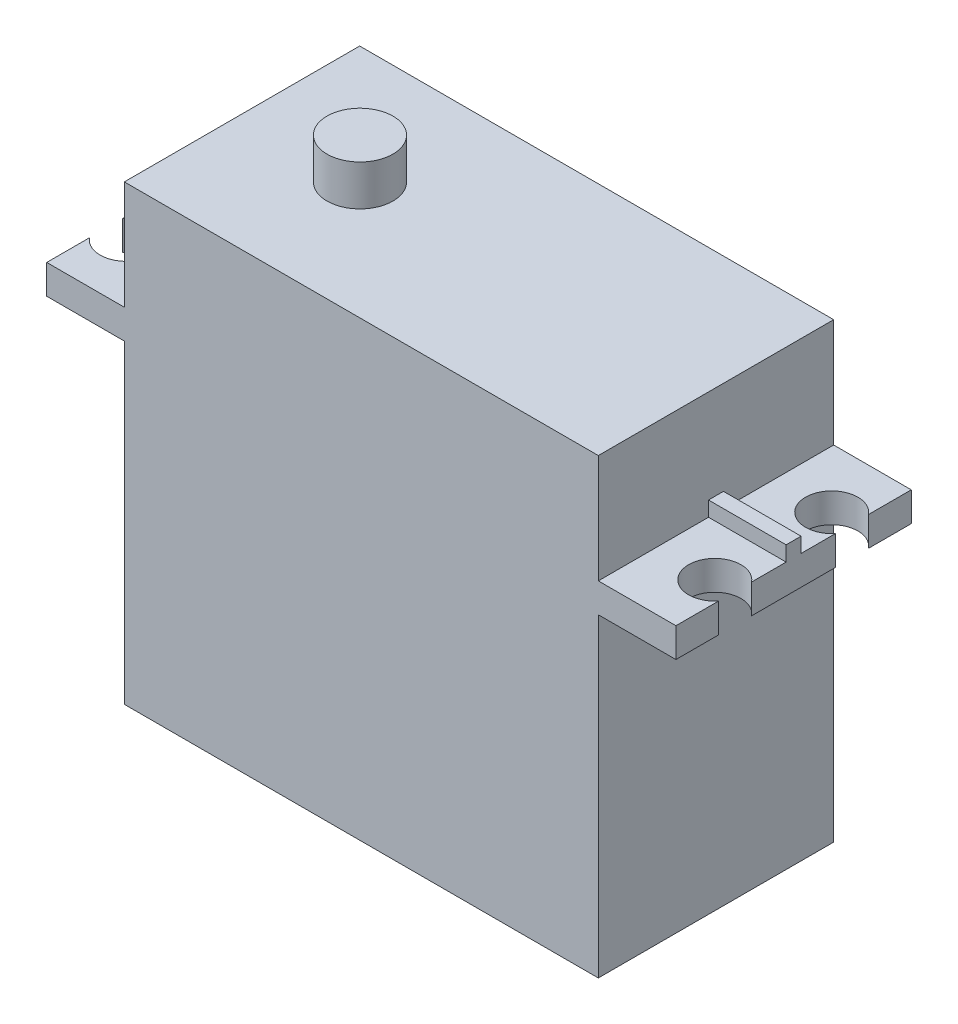
ISO-10303-21;
HEADER;
FILE_DESCRIPTION(('STEP AP214'),'2;1');
FILE_NAME('part.step','',(''),(''),'','','');
FILE_SCHEMA(('AUTOMOTIVE_DESIGN { 1 0 10303 214 1 1 1 1 }'));
ENDSEC;
DATA;
#1=APPLICATION_CONTEXT('core data for automotive mechanical design processes');
#2=APPLICATION_PROTOCOL_DEFINITION('international standard','automotive_design',2000,#1);
#3=PRODUCT_CONTEXT('',#1,'mechanical');
#4=PRODUCT('Part','Part','',(#3));
#5=PRODUCT_RELATED_PRODUCT_CATEGORY('part','',(#4));
#6=PRODUCT_DEFINITION_FORMATION('','',#4);
#7=PRODUCT_DEFINITION_CONTEXT('part definition',#1,'design');
#8=PRODUCT_DEFINITION('design','',#6,#7);
#9=PRODUCT_DEFINITION_SHAPE('','',#8);
#10=(LENGTH_UNIT() NAMED_UNIT(*) SI_UNIT(.MILLI.,.METRE.));
#11=(NAMED_UNIT(*) PLANE_ANGLE_UNIT() SI_UNIT($,.RADIAN.));
#12=(NAMED_UNIT(*) SI_UNIT($,.STERADIAN.) SOLID_ANGLE_UNIT());
#13=UNCERTAINTY_MEASURE_WITH_UNIT(LENGTH_MEASURE(1.E-05),#10,'distance_accuracy_value','');
#14=(GEOMETRIC_REPRESENTATION_CONTEXT(3) GLOBAL_UNCERTAINTY_ASSIGNED_CONTEXT((#13)) GLOBAL_UNIT_ASSIGNED_CONTEXT((#10,
#11,#12)) REPRESENTATION_CONTEXT('',''));
#15=CARTESIAN_POINT('',(0.,0.,0.));
#16=DIRECTION('',(0.,0.,1.));
#17=DIRECTION('',(1.,0.,0.));
#18=AXIS2_PLACEMENT_3D('',#15,#16,#17);
#19=CARTESIAN_POINT('',(-20.1295,9.2202,9.99490000000001));
#20=DIRECTION('',(1.,0.,0.));
#21=DIRECTION('',(0.,0.,-1.));
#22=AXIS2_PLACEMENT_3D('',#19,#20,#21);
#23=PLANE('',#22);
#24=DIRECTION('',(0.,-1.,0.));
#25=VECTOR('',#24,1.);
#26=CARTESIAN_POINT('',(-20.1295,1.27,0.635));
#27=LINE('',#26,#25);
#28=CARTESIAN_POINT('',(-20.1295,1.27,0.635));
#29=VERTEX_POINT('',#28);
#30=CARTESIAN_POINT('',(-20.1295,0.,0.635));
#31=VERTEX_POINT('',#30);
#32=EDGE_CURVE('E238',#29,#31,#27,.T.);
#33=ORIENTED_EDGE('',*,*,#32,.T.);
#34=DIRECTION('',(0.,0.,1.));
#35=VECTOR('',#34,1.);
#36=CARTESIAN_POINT('',(-20.1295,0.,9.99490000000001));
#37=LINE('',#36,#35);
#38=CARTESIAN_POINT('',(-20.1295,0.,9.9949));
#39=VERTEX_POINT('',#38);
#40=EDGE_CURVE('E449',#31,#39,#37,.T.);
#41=ORIENTED_EDGE('',*,*,#40,.T.);
#42=DIRECTION('',(0.,-1.,0.));
#43=VECTOR('',#42,1.);
#44=CARTESIAN_POINT('',(-20.1295,9.2202,9.99490000000001));
#45=LINE('',#44,#43);
#46=CARTESIAN_POINT('',(-20.1295,9.2202,9.99490000000001));
#47=VERTEX_POINT('',#46);
#48=EDGE_CURVE('E482',#47,#39,#45,.T.);
#49=ORIENTED_EDGE('',*,*,#48,.F.);
#50=DIRECTION('',(0.,0.,1.));
#51=VECTOR('',#50,1.);
#52=CARTESIAN_POINT('',(-20.1295,9.2202,9.99490000000001));
#53=LINE('',#52,#51);
#54=CARTESIAN_POINT('',(-20.1295,9.2202,-9.99490000000001));
#55=VERTEX_POINT('',#54);
#56=EDGE_CURVE('E450',#55,#47,#53,.T.);
#57=ORIENTED_EDGE('',*,*,#56,.F.);
#58=DIRECTION('',(0.,-1.,0.));
#59=VECTOR('',#58,1.);
#60=CARTESIAN_POINT('',(-20.1295,9.2202,-9.99490000000001));
#61=LINE('',#60,#59);
#62=CARTESIAN_POINT('',(-20.1295,0.,-9.9949));
#63=VERTEX_POINT('',#62);
#64=EDGE_CURVE('E464',#55,#63,#61,.T.);
#65=ORIENTED_EDGE('',*,*,#64,.T.);
#66=CARTESIAN_POINT('',(-20.1295,0.,-0.635));
#67=VERTEX_POINT('',#66);
#68=EDGE_CURVE('E465',#63,#67,#37,.T.);
#69=ORIENTED_EDGE('',*,*,#68,.T.);
#70=DIRECTION('',(0.,-1.,0.));
#71=VECTOR('',#70,1.);
#72=CARTESIAN_POINT('',(-20.1295,1.27,-0.635));
#73=LINE('',#72,#71);
#74=CARTESIAN_POINT('',(-20.1295,1.27,-0.635));
#75=VERTEX_POINT('',#74);
#76=EDGE_CURVE('E246',#75,#67,#73,.T.);
#77=ORIENTED_EDGE('',*,*,#76,.F.);
#78=DIRECTION('',(0.,0.,-1.));
#79=VECTOR('',#78,1.);
#80=CARTESIAN_POINT('',(-20.1295,1.27,0.635));
#81=LINE('',#80,#79);
#82=EDGE_CURVE('E229',#29,#75,#81,.T.);
#83=ORIENTED_EDGE('',*,*,#82,.F.);
#84=EDGE_LOOP('',(#33,#41,#49,#57,#65,#69,#77,#83));
#85=FACE_BOUND('',#84,.T.);
#86=ADVANCED_FACE('F39',(#85),#23,.F.);
#87=CARTESIAN_POINT('',(0.,0.,0.));
#88=DIRECTION('',(0.,-1.,0.));
#89=DIRECTION('',(0.,0.,-1.));
#90=AXIS2_PLACEMENT_3D('',#87,#88,#89);
#91=PLANE('',#90);
#92=DIRECTION('',(1.,0.,0.));
#93=VECTOR('',#92,1.);
#94=CARTESIAN_POINT('',(-20.1295,0.,0.635));
#95=LINE('',#94,#93);
#96=CARTESIAN_POINT('',(-26.7208,0.,0.635));
#97=VERTEX_POINT('',#96);
#98=EDGE_CURVE('E241',#97,#31,#95,.T.);
#99=ORIENTED_EDGE('',*,*,#98,.F.);
#100=DIRECTION('',(0.,0.,-1.));
#101=VECTOR('',#100,1.);
#102=CARTESIAN_POINT('',(-26.7208,0.,9.9949));
#103=LINE('',#102,#101);
#104=CARTESIAN_POINT('',(-26.7208,0.,3.5687));
#105=VERTEX_POINT('',#104);
#106=EDGE_CURVE('E422',#105,#97,#103,.T.);
#107=ORIENTED_EDGE('',*,*,#106,.F.);
#108=CARTESIAN_POINT('',(-24.9922464862204,0.,4.9657));
#109=DIRECTION('',(0.,1.,0.));
#110=DIRECTION('',(0.,0.,1.));
#111=AXIS2_PLACEMENT_3D('',#108,#109,#110);
#112=CIRCLE('',#111,2.2225);
#113=CARTESIAN_POINT('',(-26.7208,0.,6.3627));
#114=VERTEX_POINT('',#113);
#115=EDGE_CURVE('E348',#114,#105,#112,.T.);
#116=ORIENTED_EDGE('',*,*,#115,.F.);
#117=CARTESIAN_POINT('',(-26.7208,0.,9.9949));
#118=VERTEX_POINT('',#117);
#119=EDGE_CURVE('E417',#118,#114,#103,.T.);
#120=ORIENTED_EDGE('',*,*,#119,.F.);
#121=DIRECTION('',(-1.,0.,0.));
#122=VECTOR('',#121,1.);
#123=CARTESIAN_POINT('',(26.7208,0.,9.99489999999999));
#124=LINE('',#123,#122);
#125=EDGE_CURVE('E389',#39,#118,#124,.T.);
#126=ORIENTED_EDGE('',*,*,#125,.F.);
#127=ORIENTED_EDGE('',*,*,#40,.F.);
#128=EDGE_LOOP('',(#99,#107,#116,#120,#126,#127));
#129=FACE_BOUND('',#128,.T.);
#130=ADVANCED_FACE('F528',(#129),#91,.F.);
#131=DIRECTION('',(-1.,0.,0.));
#132=VECTOR('',#131,1.);
#133=CARTESIAN_POINT('',(-20.1295,0.,-0.635));
#134=LINE('',#133,#132);
#135=CARTESIAN_POINT('',(-26.7208,0.,-0.635));
#136=VERTEX_POINT('',#135);
#137=EDGE_CURVE('E235',#67,#136,#134,.T.);
#138=ORIENTED_EDGE('',*,*,#137,.F.);
#139=ORIENTED_EDGE('',*,*,#68,.F.);
#140=DIRECTION('',(-1.,0.,0.));
#141=VECTOR('',#140,1.);
#142=CARTESIAN_POINT('',(26.7208,0.,-9.99490000000001));
#143=LINE('',#142,#141);
#144=CARTESIAN_POINT('',(-26.7208,0.,-9.9949));
#145=VERTEX_POINT('',#144);
#146=EDGE_CURVE('E421',#63,#145,#143,.T.);
#147=ORIENTED_EDGE('',*,*,#146,.T.);
#148=CARTESIAN_POINT('',(-26.7208,0.,-6.3627));
#149=VERTEX_POINT('',#148);
#150=EDGE_CURVE('E416',#149,#145,#103,.T.);
#151=ORIENTED_EDGE('',*,*,#150,.F.);
#152=CARTESIAN_POINT('',(-24.9922464862204,0.,-4.9657));
#153=DIRECTION('',(0.,1.,0.));
#154=DIRECTION('',(0.,0.,1.));
#155=AXIS2_PLACEMENT_3D('',#152,#153,#154);
#156=CIRCLE('',#155,2.2225);
#157=CARTESIAN_POINT('',(-26.7208,0.,-3.5687));
#158=VERTEX_POINT('',#157);
#159=EDGE_CURVE('E351',#158,#149,#156,.T.);
#160=ORIENTED_EDGE('',*,*,#159,.F.);
#161=EDGE_CURVE('E423',#136,#158,#103,.T.);
#162=ORIENTED_EDGE('',*,*,#161,.F.);
#163=EDGE_LOOP('',(#138,#139,#147,#151,#160,#162));
#164=FACE_BOUND('',#163,.T.);
#165=ADVANCED_FACE('F628',(#164),#91,.F.);
#166=CARTESIAN_POINT('',(20.1295,9.2202,9.99490000000001));
#167=DIRECTION('',(-1.,0.,0.));
#168=DIRECTION('',(0.,0.,1.));
#169=AXIS2_PLACEMENT_3D('',#166,#167,#168);
#170=PLANE('',#169);
#171=DIRECTION('',(0.,-1.,0.));
#172=VECTOR('',#171,1.);
#173=CARTESIAN_POINT('',(20.1295,1.27,-0.635));
#174=LINE('',#173,#172);
#175=CARTESIAN_POINT('',(20.1295,1.27,-0.635));
#176=VERTEX_POINT('',#175);
#177=CARTESIAN_POINT('',(20.1295,0.,-0.635));
#178=VERTEX_POINT('',#177);
#179=EDGE_CURVE('E296',#176,#178,#174,.T.);
#180=ORIENTED_EDGE('',*,*,#179,.T.);
#181=DIRECTION('',(0.,0.,-1.));
#182=VECTOR('',#181,1.);
#183=CARTESIAN_POINT('',(20.1295,0.,9.99490000000001));
#184=LINE('',#183,#182);
#185=CARTESIAN_POINT('',(20.1295,0.,-9.99490000000001));
#186=VERTEX_POINT('',#185);
#187=EDGE_CURVE('E468',#178,#186,#184,.T.);
#188=ORIENTED_EDGE('',*,*,#187,.T.);
#189=DIRECTION('',(0.,-1.,0.));
#190=VECTOR('',#189,1.);
#191=CARTESIAN_POINT('',(20.1295,9.2202,-9.99490000000001));
#192=LINE('',#191,#190);
#193=CARTESIAN_POINT('',(20.1295,9.2202,-9.99490000000001));
#194=VERTEX_POINT('',#193);
#195=EDGE_CURVE('E474',#194,#186,#192,.T.);
#196=ORIENTED_EDGE('',*,*,#195,.F.);
#197=DIRECTION('',(0.,0.,-1.));
#198=VECTOR('',#197,1.);
#199=CARTESIAN_POINT('',(20.1295,9.2202,9.99490000000001));
#200=LINE('',#199,#198);
#201=CARTESIAN_POINT('',(20.1295,9.2202,9.99490000000001));
#202=VERTEX_POINT('',#201);
#203=EDGE_CURVE('E458',#202,#194,#200,.T.);
#204=ORIENTED_EDGE('',*,*,#203,.F.);
#205=DIRECTION('',(0.,-1.,0.));
#206=VECTOR('',#205,1.);
#207=CARTESIAN_POINT('',(20.1295,9.2202,9.99490000000001));
#208=LINE('',#207,#206);
#209=CARTESIAN_POINT('',(20.1295,0.,9.99489999999999));
#210=VERTEX_POINT('',#209);
#211=EDGE_CURVE('E478',#202,#210,#208,.T.);
#212=ORIENTED_EDGE('',*,*,#211,.T.);
#213=CARTESIAN_POINT('',(20.1295,0.,0.635));
#214=VERTEX_POINT('',#213);
#215=EDGE_CURVE('E455',#210,#214,#184,.T.);
#216=ORIENTED_EDGE('',*,*,#215,.T.);
#217=DIRECTION('',(0.,-1.,0.));
#218=VECTOR('',#217,1.);
#219=CARTESIAN_POINT('',(20.1295,1.27,0.635));
#220=LINE('',#219,#218);
#221=CARTESIAN_POINT('',(20.1295,1.27,0.635));
#222=VERTEX_POINT('',#221);
#223=EDGE_CURVE('E62',#222,#214,#220,.T.);
#224=ORIENTED_EDGE('',*,*,#223,.F.);
#225=DIRECTION('',(0.,0.,1.));
#226=VECTOR('',#225,1.);
#227=CARTESIAN_POINT('',(20.1295,1.27,0.635));
#228=LINE('',#227,#226);
#229=EDGE_CURVE('E278',#176,#222,#228,.T.);
#230=ORIENTED_EDGE('',*,*,#229,.F.);
#231=EDGE_LOOP('',(#180,#188,#196,#204,#212,#216,#224,#230));
#232=FACE_BOUND('',#231,.T.);
#233=ADVANCED_FACE('F552',(#232),#170,.F.);
#234=DIRECTION('',(-1.,0.,0.));
#235=VECTOR('',#234,1.);
#236=CARTESIAN_POINT('',(20.1295,0.,-0.635));
#237=LINE('',#236,#235);
#238=CARTESIAN_POINT('',(26.7208,0.,-0.635));
#239=VERTEX_POINT('',#238);
#240=EDGE_CURVE('E245',#239,#178,#237,.T.);
#241=ORIENTED_EDGE('',*,*,#240,.F.);
#242=DIRECTION('',(0.,0.,-1.));
#243=VECTOR('',#242,1.);
#244=CARTESIAN_POINT('',(26.7208,0.,9.99489999999999));
#245=LINE('',#244,#243);
#246=CARTESIAN_POINT('',(26.7208,0.,-3.56869999999997));
#247=VERTEX_POINT('',#246);
#248=EDGE_CURVE('E434',#239,#247,#245,.T.);
#249=ORIENTED_EDGE('',*,*,#248,.T.);
#250=CARTESIAN_POINT('',(24.9922464862204,0.,-4.9657));
#251=DIRECTION('',(0.,-1.,0.));
#252=DIRECTION('',(0.,0.,-1.));
#253=AXIS2_PLACEMENT_3D('',#250,#251,#252);
#254=CIRCLE('',#253,2.2225);
#255=CARTESIAN_POINT('',(26.7208,0.,-6.36270000000002));
#256=VERTEX_POINT('',#255);
#257=EDGE_CURVE('E490',#247,#256,#254,.T.);
#258=ORIENTED_EDGE('',*,*,#257,.T.);
#259=CARTESIAN_POINT('',(26.7208,0.,-9.99490000000001));
#260=VERTEX_POINT('',#259);
#261=EDGE_CURVE('E428',#256,#260,#245,.T.);
#262=ORIENTED_EDGE('',*,*,#261,.T.);
#263=EDGE_CURVE('E424',#260,#186,#143,.T.);
#264=ORIENTED_EDGE('',*,*,#263,.T.);
#265=ORIENTED_EDGE('',*,*,#187,.F.);
#266=EDGE_LOOP('',(#241,#249,#258,#262,#264,#265));
#267=FACE_BOUND('',#266,.T.);
#268=ADVANCED_FACE('F558',(#267),#91,.F.);
#269=DIRECTION('',(1.,0.,0.));
#270=VECTOR('',#269,1.);
#271=CARTESIAN_POINT('',(20.1295,0.,0.635));
#272=LINE('',#271,#270);
#273=CARTESIAN_POINT('',(26.7208,0.,0.635));
#274=VERTEX_POINT('',#273);
#275=EDGE_CURVE('E274',#214,#274,#272,.T.);
#276=ORIENTED_EDGE('',*,*,#275,.F.);
#277=ORIENTED_EDGE('',*,*,#215,.F.);
#278=CARTESIAN_POINT('',(26.7208,0.,9.99489999999999));
#279=VERTEX_POINT('',#278);
#280=EDGE_CURVE('E412',#279,#210,#124,.T.);
#281=ORIENTED_EDGE('',*,*,#280,.F.);
#282=CARTESIAN_POINT('',(26.7208,0.,6.36270000000003));
#283=VERTEX_POINT('',#282);
#284=EDGE_CURVE('E429',#279,#283,#245,.T.);
#285=ORIENTED_EDGE('',*,*,#284,.T.);
#286=CARTESIAN_POINT('',(24.9922464862204,0.,4.9657));
#287=DIRECTION('',(0.,-1.,0.));
#288=DIRECTION('',(0.,0.,-1.));
#289=AXIS2_PLACEMENT_3D('',#286,#287,#288);
#290=CIRCLE('',#289,2.2225);
#291=CARTESIAN_POINT('',(26.7208,0.,3.56869999999997));
#292=VERTEX_POINT('',#291);
#293=EDGE_CURVE('E486',#283,#292,#290,.T.);
#294=ORIENTED_EDGE('',*,*,#293,.T.);
#295=EDGE_CURVE('E433',#292,#274,#245,.T.);
#296=ORIENTED_EDGE('',*,*,#295,.T.);
#297=EDGE_LOOP('',(#276,#277,#281,#285,#294,#296));
#298=FACE_BOUND('',#297,.T.);
#299=ADVANCED_FACE('F569',(#298),#91,.F.);
#300=CARTESIAN_POINT('',(0.,-2.4892,0.));
#301=DIRECTION('',(0.,-1.,0.));
#302=DIRECTION('',(0.,0.,-1.));
#303=AXIS2_PLACEMENT_3D('',#300,#301,#302);
#304=PLANE('',#303);
#305=DIRECTION('',(0.,0.,-1.));
#306=VECTOR('',#305,1.);
#307=CARTESIAN_POINT('',(-20.1295,-2.4892,0.));
#308=LINE('',#307,#306);
#309=CARTESIAN_POINT('',(-20.1295,-2.48920000000001,9.99490000000001));
#310=VERTEX_POINT('',#309);
#311=CARTESIAN_POINT('',(-20.1295,-2.4892,-9.9949));
#312=VERTEX_POINT('',#311);
#313=EDGE_CURVE('E11',#310,#312,#308,.T.);
#314=ORIENTED_EDGE('',*,*,#313,.F.);
#315=DIRECTION('',(-1.,0.,0.));
#316=VECTOR('',#315,1.);
#317=CARTESIAN_POINT('',(26.7208,-2.4892,9.99489999999999));
#318=LINE('',#317,#316);
#319=CARTESIAN_POINT('',(-26.7208,-2.4892,9.9949));
#320=VERTEX_POINT('',#319);
#321=EDGE_CURVE('E394',#310,#320,#318,.T.);
#322=ORIENTED_EDGE('',*,*,#321,.T.);
#323=DIRECTION('',(0.,0.,-1.));
#324=VECTOR('',#323,1.);
#325=CARTESIAN_POINT('',(-26.7208,-2.4892,9.9949));
#326=LINE('',#325,#324);
#327=CARTESIAN_POINT('',(-26.7208,-2.4892,6.3627));
#328=VERTEX_POINT('',#327);
#329=EDGE_CURVE('E395',#320,#328,#326,.T.);
#330=ORIENTED_EDGE('',*,*,#329,.T.);
#331=CARTESIAN_POINT('',(-24.9922464862204,-2.4892,4.9657));
#332=DIRECTION('',(0.,-1.,0.));
#333=DIRECTION('',(0.,0.,-1.));
#334=AXIS2_PLACEMENT_3D('',#331,#332,#333);
#335=CIRCLE('',#334,2.2225);
#336=CARTESIAN_POINT('',(-26.7208,-2.4892,3.5687));
#337=VERTEX_POINT('',#336);
#338=EDGE_CURVE('E47',#337,#328,#335,.T.);
#339=ORIENTED_EDGE('',*,*,#338,.F.);
#340=CARTESIAN_POINT('',(-26.7208,-2.4892,-3.5687));
#341=VERTEX_POINT('',#340);
#342=EDGE_CURVE('E400',#337,#341,#326,.T.);
#343=ORIENTED_EDGE('',*,*,#342,.T.);
#344=CARTESIAN_POINT('',(-24.9922464862204,-2.4892,-4.9657));
#345=DIRECTION('',(0.,-1.,0.));
#346=DIRECTION('',(0.,0.,-1.));
#347=AXIS2_PLACEMENT_3D('',#344,#345,#346);
#348=CIRCLE('',#347,2.2225);
#349=CARTESIAN_POINT('',(-26.7208,-2.4892,-6.3627));
#350=VERTEX_POINT('',#349);
#351=EDGE_CURVE('E494',#350,#341,#348,.T.);
#352=ORIENTED_EDGE('',*,*,#351,.F.);
#353=CARTESIAN_POINT('',(-26.7208,-2.4892,-9.9949));
#354=VERTEX_POINT('',#353);
#355=EDGE_CURVE('E393',#350,#354,#326,.T.);
#356=ORIENTED_EDGE('',*,*,#355,.T.);
#357=DIRECTION('',(-1.,0.,0.));
#358=VECTOR('',#357,1.);
#359=CARTESIAN_POINT('',(26.7208,-2.4892,-9.99490000000001));
#360=LINE('',#359,#358);
#361=EDGE_CURVE('E399',#312,#354,#360,.T.);
#362=ORIENTED_EDGE('',*,*,#361,.F.);
#363=EDGE_LOOP('',(#314,#322,#330,#339,#343,#352,#356,#362));
#364=FACE_BOUND('',#363,.T.);
#365=ADVANCED_FACE('F510',(#364),#304,.T.);
#366=CARTESIAN_POINT('',(-26.7208,-2.4892,9.9949));
#367=DIRECTION('',(1.,0.,0.));
#368=DIRECTION('',(0.,0.,-1.));
#369=AXIS2_PLACEMENT_3D('',#366,#367,#368);
#370=PLANE('',#369);
#371=ORIENTED_EDGE('',*,*,#342,.F.);
#372=DIRECTION('',(0.,1.,0.));
#373=VECTOR('',#372,1.);
#374=CARTESIAN_POINT('',(-26.7208,-2.4892,3.5687));
#375=LINE('',#374,#373);
#376=EDGE_CURVE('E385',#337,#105,#375,.T.);
#377=ORIENTED_EDGE('',*,*,#376,.T.);
#378=ORIENTED_EDGE('',*,*,#106,.T.);
#379=DIRECTION('',(0.,-1.,0.));
#380=VECTOR('',#379,1.);
#381=CARTESIAN_POINT('',(-26.7208,1.27,0.635));
#382=LINE('',#381,#380);
#383=CARTESIAN_POINT('',(-26.7208,1.27,0.635));
#384=VERTEX_POINT('',#383);
#385=EDGE_CURVE('E258',#384,#97,#382,.T.);
#386=ORIENTED_EDGE('',*,*,#385,.F.);
#387=DIRECTION('',(0.,0.,1.));
#388=VECTOR('',#387,1.);
#389=CARTESIAN_POINT('',(-26.7208,1.27,0.635));
#390=LINE('',#389,#388);
#391=CARTESIAN_POINT('',(-26.7208,1.27,-0.635));
#392=VERTEX_POINT('',#391);
#393=EDGE_CURVE('E231',#392,#384,#390,.T.);
#394=ORIENTED_EDGE('',*,*,#393,.F.);
#395=DIRECTION('',(0.,-1.,0.));
#396=VECTOR('',#395,1.);
#397=CARTESIAN_POINT('',(-26.7208,1.27,-0.635));
#398=LINE('',#397,#396);
#399=EDGE_CURVE('E54',#392,#136,#398,.T.);
#400=ORIENTED_EDGE('',*,*,#399,.T.);
#401=ORIENTED_EDGE('',*,*,#161,.T.);
#402=DIRECTION('',(0.,1.,0.));
#403=VECTOR('',#402,1.);
#404=CARTESIAN_POINT('',(-26.7208,-2.4892,-3.5687));
#405=LINE('',#404,#403);
#406=EDGE_CURVE('E373',#158,#341,#405,.F.);
#407=ORIENTED_EDGE('',*,*,#406,.T.);
#408=EDGE_LOOP('',(#371,#377,#378,#386,#394,#400,#401,#407));
#409=FACE_BOUND('',#408,.T.);
#410=ADVANCED_FACE('F530',(#409),#370,.F.);
#411=ORIENTED_EDGE('',*,*,#355,.F.);
#412=DIRECTION('',(0.,1.,0.));
#413=VECTOR('',#412,1.);
#414=CARTESIAN_POINT('',(-26.7208,-2.4892,-6.3627));
#415=LINE('',#414,#413);
#416=EDGE_CURVE('E377',#350,#149,#415,.T.);
#417=ORIENTED_EDGE('',*,*,#416,.T.);
#418=ORIENTED_EDGE('',*,*,#150,.T.);
#419=DIRECTION('',(0.,1.,0.));
#420=VECTOR('',#419,1.);
#421=CARTESIAN_POINT('',(-26.7208,-2.4892,-9.9949));
#422=LINE('',#421,#420);
#423=EDGE_CURVE('E441',#354,#145,#422,.T.);
#424=ORIENTED_EDGE('',*,*,#423,.F.);
#425=EDGE_LOOP('',(#411,#417,#418,#424));
#426=FACE_BOUND('',#425,.T.);
#427=ADVANCED_FACE('F538',(#426),#370,.F.);
#428=CARTESIAN_POINT('',(26.7208,-2.4892,9.99489999999999));
#429=DIRECTION('',(1.,0.,0.));
#430=DIRECTION('',(0.,0.,-1.));
#431=AXIS2_PLACEMENT_3D('',#428,#429,#430);
#432=PLANE('',#431);
#433=DIRECTION('',(0.,1.,0.));
#434=VECTOR('',#433,1.);
#435=CARTESIAN_POINT('',(26.7208,-2.4892,-6.36270000000002));
#436=LINE('',#435,#434);
#437=CARTESIAN_POINT('',(26.7208,-2.4892,-6.36270000000002));
#438=VERTEX_POINT('',#437);
#439=EDGE_CURVE('E370',#438,#256,#436,.T.);
#440=ORIENTED_EDGE('',*,*,#439,.F.);
#441=DIRECTION('',(0.,0.,-1.));
#442=VECTOR('',#441,1.);
#443=CARTESIAN_POINT('',(26.7208,-2.4892,9.99489999999999));
#444=LINE('',#443,#442);
#445=CARTESIAN_POINT('',(26.7208,-2.4892,-9.99490000000001));
#446=VERTEX_POINT('',#445);
#447=EDGE_CURVE('E405',#438,#446,#444,.T.);
#448=ORIENTED_EDGE('',*,*,#447,.T.);
#449=DIRECTION('',(0.,1.,0.));
#450=VECTOR('',#449,1.);
#451=CARTESIAN_POINT('',(26.7208,-2.4892,-9.99490000000001));
#452=LINE('',#451,#450);
#453=EDGE_CURVE('E437',#446,#260,#452,.T.);
#454=ORIENTED_EDGE('',*,*,#453,.T.);
#455=ORIENTED_EDGE('',*,*,#261,.F.);
#456=EDGE_LOOP('',(#440,#448,#454,#455));
#457=FACE_BOUND('',#456,.T.);
#458=ADVANCED_FACE('F601',(#457),#432,.T.);
#459=DIRECTION('',(0.,1.,0.));
#460=VECTOR('',#459,1.);
#461=CARTESIAN_POINT('',(26.7208,-2.4892,-3.56869999999997));
#462=LINE('',#461,#460);
#463=CARTESIAN_POINT('',(26.7208,-2.4892,-3.56869999999997));
#464=VERTEX_POINT('',#463);
#465=EDGE_CURVE('E367',#247,#464,#462,.F.);
#466=ORIENTED_EDGE('',*,*,#465,.F.);
#467=ORIENTED_EDGE('',*,*,#248,.F.);
#468=DIRECTION('',(0.,-1.,0.));
#469=VECTOR('',#468,1.);
#470=CARTESIAN_POINT('',(26.7208,1.27,-0.635));
#471=LINE('',#470,#469);
#472=CARTESIAN_POINT('',(26.7208,1.27,-0.635));
#473=VERTEX_POINT('',#472);
#474=EDGE_CURVE('E299',#473,#239,#471,.T.);
#475=ORIENTED_EDGE('',*,*,#474,.F.);
#476=DIRECTION('',(0.,0.,-1.));
#477=VECTOR('',#476,1.);
#478=CARTESIAN_POINT('',(26.7208,1.27,0.635));
#479=LINE('',#478,#477);
#480=CARTESIAN_POINT('',(26.7208,1.27,0.635));
#481=VERTEX_POINT('',#480);
#482=EDGE_CURVE('E269',#481,#473,#479,.T.);
#483=ORIENTED_EDGE('',*,*,#482,.F.);
#484=DIRECTION('',(0.,-1.,0.));
#485=VECTOR('',#484,1.);
#486=CARTESIAN_POINT('',(26.7208,1.27,0.635));
#487=LINE('',#486,#485);
#488=EDGE_CURVE('E284',#481,#274,#487,.T.);
#489=ORIENTED_EDGE('',*,*,#488,.T.);
#490=ORIENTED_EDGE('',*,*,#295,.F.);
#491=DIRECTION('',(0.,1.,0.));
#492=VECTOR('',#491,1.);
#493=CARTESIAN_POINT('',(26.7208,-2.4892,3.56869999999997));
#494=LINE('',#493,#492);
#495=CARTESIAN_POINT('',(26.7208,-2.4892,3.56869999999997));
#496=VERTEX_POINT('',#495);
#497=EDGE_CURVE('E364',#496,#292,#494,.T.);
#498=ORIENTED_EDGE('',*,*,#497,.F.);
#499=EDGE_CURVE('E411',#496,#464,#444,.T.);
#500=ORIENTED_EDGE('',*,*,#499,.T.);
#501=EDGE_LOOP('',(#466,#467,#475,#483,#489,#490,#498,#500));
#502=FACE_BOUND('',#501,.T.);
#503=ADVANCED_FACE('F583',(#502),#432,.T.);
#504=CARTESIAN_POINT('',(20.1295,9.2202,9.99490000000001));
#505=DIRECTION('',(0.,0.,-1.));
#506=DIRECTION('',(-1.,0.,0.));
#507=AXIS2_PLACEMENT_3D('',#504,#505,#506);
#508=PLANE('',#507);
#509=ORIENTED_EDGE('',*,*,#48,.T.);
#510=ORIENTED_EDGE('',*,*,#125,.T.);
#511=DIRECTION('',(0.,1.,0.));
#512=VECTOR('',#511,1.);
#513=CARTESIAN_POINT('',(-26.7208,-2.4892,9.9949));
#514=LINE('',#513,#512);
#515=EDGE_CURVE('E445',#320,#118,#514,.T.);
#516=ORIENTED_EDGE('',*,*,#515,.F.);
#517=ORIENTED_EDGE('',*,*,#321,.F.);
#518=DIRECTION('',(0.,1.,0.));
#519=VECTOR('',#518,1.);
#520=CARTESIAN_POINT('',(-20.1295,-29.21,9.99490000000001));
#521=LINE('',#520,#519);
#522=CARTESIAN_POINT('',(-20.1295,-29.21,9.99490000000001));
#523=VERTEX_POINT('',#522);
#524=EDGE_CURVE('E319',#523,#310,#521,.T.);
#525=ORIENTED_EDGE('',*,*,#524,.F.);
#526=DIRECTION('',(1.,0.,0.));
#527=VECTOR('',#526,1.);
#528=CARTESIAN_POINT('',(20.1295,-29.21,9.99490000000001));
#529=LINE('',#528,#527);
#530=CARTESIAN_POINT('',(20.1295,-29.21,9.99490000000001));
#531=VERTEX_POINT('',#530);
#532=EDGE_CURVE('E307',#523,#531,#529,.T.);
#533=ORIENTED_EDGE('',*,*,#532,.T.);
#534=DIRECTION('',(0.,1.,0.));
#535=VECTOR('',#534,1.);
#536=CARTESIAN_POINT('',(20.1295,-29.21,9.99490000000001));
#537=LINE('',#536,#535);
#538=CARTESIAN_POINT('',(20.1295,-2.4892,9.99489999999999));
#539=VERTEX_POINT('',#538);
#540=EDGE_CURVE('E329',#531,#539,#537,.T.);
#541=ORIENTED_EDGE('',*,*,#540,.T.);
#542=CARTESIAN_POINT('',(26.7208,-2.4892,9.99489999999999));
#543=VERTEX_POINT('',#542);
#544=EDGE_CURVE('E390',#543,#539,#318,.T.);
#545=ORIENTED_EDGE('',*,*,#544,.F.);
#546=DIRECTION('',(0.,1.,0.));
#547=VECTOR('',#546,1.);
#548=CARTESIAN_POINT('',(26.7208,-2.4892,9.99489999999999));
#549=LINE('',#548,#547);
#550=EDGE_CURVE('E410',#543,#279,#549,.T.);
#551=ORIENTED_EDGE('',*,*,#550,.T.);
#552=ORIENTED_EDGE('',*,*,#280,.T.);
#553=ORIENTED_EDGE('',*,*,#211,.F.);
#554=DIRECTION('',(1.,0.,0.));
#555=VECTOR('',#554,1.);
#556=CARTESIAN_POINT('',(20.1295,9.2202,9.99490000000001));
#557=LINE('',#556,#555);
#558=EDGE_CURVE('E454',#47,#202,#557,.T.);
#559=ORIENTED_EDGE('',*,*,#558,.F.);
#560=EDGE_LOOP('',(#509,#510,#516,#517,#525,#533,#541,#545,#551,#552,#553,#559));
#561=FACE_BOUND('',#560,.T.);
#562=ADVANCED_FACE('F525',(#561),#508,.F.);
#563=CARTESIAN_POINT('',(20.1295,9.2202,-9.99490000000001));
#564=DIRECTION('',(0.,0.,1.));
#565=DIRECTION('',(1.,0.,0.));
#566=AXIS2_PLACEMENT_3D('',#563,#564,#565);
#567=PLANE('',#566);
#568=ORIENTED_EDGE('',*,*,#195,.T.);
#569=ORIENTED_EDGE('',*,*,#263,.F.);
#570=ORIENTED_EDGE('',*,*,#453,.F.);
#571=CARTESIAN_POINT('',(20.1295,-2.4892,-9.99490000000001));
#572=VERTEX_POINT('',#571);
#573=EDGE_CURVE('E401',#446,#572,#360,.T.);
#574=ORIENTED_EDGE('',*,*,#573,.T.);
#575=DIRECTION('',(0.,1.,0.));
#576=VECTOR('',#575,1.);
#577=CARTESIAN_POINT('',(20.1295,-29.21,-9.99490000000001));
#578=LINE('',#577,#576);
#579=CARTESIAN_POINT('',(20.1295,-29.21,-9.99490000000001));
#580=VERTEX_POINT('',#579);
#581=EDGE_CURVE('E325',#580,#572,#578,.T.);
#582=ORIENTED_EDGE('',*,*,#581,.F.);
#583=DIRECTION('',(-1.,0.,0.));
#584=VECTOR('',#583,1.);
#585=CARTESIAN_POINT('',(20.1295,-29.21,-9.99490000000001));
#586=LINE('',#585,#584);
#587=CARTESIAN_POINT('',(-20.1295,-29.21,-9.99490000000001));
#588=VERTEX_POINT('',#587);
#589=EDGE_CURVE('E315',#580,#588,#586,.T.);
#590=ORIENTED_EDGE('',*,*,#589,.T.);
#591=DIRECTION('',(0.,1.,0.));
#592=VECTOR('',#591,1.);
#593=CARTESIAN_POINT('',(-20.1295,-29.21,-9.99490000000001));
#594=LINE('',#593,#592);
#595=EDGE_CURVE('E320',#588,#312,#594,.T.);
#596=ORIENTED_EDGE('',*,*,#595,.T.);
#597=ORIENTED_EDGE('',*,*,#361,.T.);
#598=ORIENTED_EDGE('',*,*,#423,.T.);
#599=ORIENTED_EDGE('',*,*,#146,.F.);
#600=ORIENTED_EDGE('',*,*,#64,.F.);
#601=DIRECTION('',(-1.,0.,0.));
#602=VECTOR('',#601,1.);
#603=CARTESIAN_POINT('',(20.1295,9.2202,-9.99490000000001));
#604=LINE('',#603,#602);
#605=EDGE_CURVE('E461',#194,#55,#604,.T.);
#606=ORIENTED_EDGE('',*,*,#605,.F.);
#607=EDGE_LOOP('',(#568,#569,#570,#574,#582,#590,#596,#597,#598,#599,#600,#606));
#608=FACE_BOUND('',#607,.T.);
#609=ADVANCED_FACE('F542',(#608),#567,.F.);
#610=CARTESIAN_POINT('',(0.,9.2202,0.));
#611=DIRECTION('',(0.,1.,0.));
#612=DIRECTION('',(0.,0.,1.));
#613=AXIS2_PLACEMENT_3D('',#610,#611,#612);
#614=PLANE('',#613);
#615=CARTESIAN_POINT('',(-10.1092,9.2202,0.));
#616=DIRECTION('',(0.,1.,0.));
#617=DIRECTION('',(0.,0.,1.));
#618=AXIS2_PLACEMENT_3D('',#615,#616,#617);
#619=CIRCLE('',#618,2.799999988);
#620=CARTESIAN_POINT('',(-10.1092,9.2202,2.799999988));
#621=VERTEX_POINT('',#620);
#622=EDGE_CURVE('E339',#621,#621,#619,.T.);
#623=ORIENTED_EDGE('',*,*,#622,.F.);
#624=EDGE_LOOP('',(#623));
#625=FACE_BOUND('',#624,.T.);
#626=ORIENTED_EDGE('',*,*,#56,.T.);
#627=ORIENTED_EDGE('',*,*,#558,.T.);
#628=ORIENTED_EDGE('',*,*,#203,.T.);
#629=ORIENTED_EDGE('',*,*,#605,.T.);
#630=EDGE_LOOP('',(#626,#627,#628,#629));
#631=FACE_BOUND('',#630,.T.);
#632=ADVANCED_FACE('F563',(#625,#631),#614,.T.);
#633=ORIENTED_EDGE('',*,*,#119,.T.);
#634=DIRECTION('',(0.,1.,0.));
#635=VECTOR('',#634,1.);
#636=CARTESIAN_POINT('',(-26.7208,-2.4892,6.3627));
#637=LINE('',#636,#635);
#638=EDGE_CURVE('E381',#114,#328,#637,.F.);
#639=ORIENTED_EDGE('',*,*,#638,.T.);
#640=ORIENTED_EDGE('',*,*,#329,.F.);
#641=ORIENTED_EDGE('',*,*,#515,.T.);
#642=EDGE_LOOP('',(#633,#639,#640,#641));
#643=FACE_BOUND('',#642,.T.);
#644=ADVANCED_FACE('F506',(#643),#370,.F.);
#645=DIRECTION('',(0.,1.,0.));
#646=VECTOR('',#645,1.);
#647=CARTESIAN_POINT('',(26.7208,-2.4892,6.36270000000003));
#648=LINE('',#647,#646);
#649=CARTESIAN_POINT('',(26.7208,-2.4892,6.36270000000003));
#650=VERTEX_POINT('',#649);
#651=EDGE_CURVE('E361',#283,#650,#648,.F.);
#652=ORIENTED_EDGE('',*,*,#651,.F.);
#653=ORIENTED_EDGE('',*,*,#284,.F.);
#654=ORIENTED_EDGE('',*,*,#550,.F.);
#655=EDGE_CURVE('E406',#543,#650,#444,.T.);
#656=ORIENTED_EDGE('',*,*,#655,.T.);
#657=EDGE_LOOP('',(#652,#653,#654,#656));
#658=FACE_BOUND('',#657,.T.);
#659=ADVANCED_FACE('F572',(#658),#432,.T.);
#660=DIRECTION('',(0.,0.,1.));
#661=VECTOR('',#660,1.);
#662=CARTESIAN_POINT('',(20.1295,-2.4892,0.));
#663=LINE('',#662,#661);
#664=EDGE_CURVE('E324',#572,#539,#663,.T.);
#665=ORIENTED_EDGE('',*,*,#664,.F.);
#666=ORIENTED_EDGE('',*,*,#573,.F.);
#667=ORIENTED_EDGE('',*,*,#447,.F.);
#668=CARTESIAN_POINT('',(24.9922464862204,-2.4892,-4.9657));
#669=DIRECTION('',(0.,1.,0.));
#670=DIRECTION('',(0.,0.,-1.));
#671=AXIS2_PLACEMENT_3D('',#668,#669,#670);
#672=CIRCLE('',#671,2.2225);
#673=EDGE_CURVE('E344',#438,#464,#672,.T.);
#674=ORIENTED_EDGE('',*,*,#673,.T.);
#675=ORIENTED_EDGE('',*,*,#499,.F.);
#676=CARTESIAN_POINT('',(24.9922464862204,-2.4892,4.9657));
#677=DIRECTION('',(0.,1.,0.));
#678=DIRECTION('',(0.,0.,-1.));
#679=AXIS2_PLACEMENT_3D('',#676,#677,#678);
#680=CIRCLE('',#679,2.2225);
#681=EDGE_CURVE('E352',#496,#650,#680,.T.);
#682=ORIENTED_EDGE('',*,*,#681,.T.);
#683=ORIENTED_EDGE('',*,*,#655,.F.);
#684=ORIENTED_EDGE('',*,*,#544,.T.);
#685=EDGE_LOOP('',(#665,#666,#667,#674,#675,#682,#683,#684));
#686=FACE_BOUND('',#685,.T.);
#687=ADVANCED_FACE('F579',(#686),#304,.T.);
#688=CARTESIAN_POINT('',(24.9922464862204,-2.4892,4.9657));
#689=DIRECTION('',(0.,1.,0.));
#690=DIRECTION('',(0.,0.,1.));
#691=AXIS2_PLACEMENT_3D('',#688,#689,#690);
#692=CYLINDRICAL_SURFACE('',#691,2.2225);
#693=ORIENTED_EDGE('',*,*,#497,.T.);
#694=ORIENTED_EDGE('',*,*,#293,.F.);
#695=ORIENTED_EDGE('',*,*,#651,.T.);
#696=ORIENTED_EDGE('',*,*,#681,.F.);
#697=EDGE_LOOP('',(#693,#694,#695,#696));
#698=FACE_BOUND('',#697,.T.);
#699=ADVANCED_FACE('F575',(#698),#692,.F.);
#700=CARTESIAN_POINT('',(24.9922464862204,-2.4892,-4.9657));
#701=DIRECTION('',(0.,1.,0.));
#702=DIRECTION('',(0.,0.,1.));
#703=AXIS2_PLACEMENT_3D('',#700,#701,#702);
#704=CYLINDRICAL_SURFACE('',#703,2.2225);
#705=ORIENTED_EDGE('',*,*,#439,.T.);
#706=ORIENTED_EDGE('',*,*,#257,.F.);
#707=ORIENTED_EDGE('',*,*,#465,.T.);
#708=ORIENTED_EDGE('',*,*,#673,.F.);
#709=EDGE_LOOP('',(#705,#706,#707,#708));
#710=FACE_BOUND('',#709,.T.);
#711=ADVANCED_FACE('F598',(#710),#704,.F.);
#712=CARTESIAN_POINT('',(-24.9922464862204,-2.4892,-4.9657));
#713=DIRECTION('',(0.,1.,0.));
#714=DIRECTION('',(0.,0.,1.));
#715=AXIS2_PLACEMENT_3D('',#712,#713,#714);
#716=CYLINDRICAL_SURFACE('',#715,2.2225);
#717=ORIENTED_EDGE('',*,*,#351,.T.);
#718=ORIENTED_EDGE('',*,*,#406,.F.);
#719=ORIENTED_EDGE('',*,*,#159,.T.);
#720=ORIENTED_EDGE('',*,*,#416,.F.);
#721=EDGE_LOOP('',(#717,#718,#719,#720));
#722=FACE_BOUND('',#721,.T.);
#723=ADVANCED_FACE('F704',(#722),#716,.F.);
#724=CARTESIAN_POINT('',(-24.9922464862204,-2.4892,4.9657));
#725=DIRECTION('',(0.,1.,0.));
#726=DIRECTION('',(0.,0.,1.));
#727=AXIS2_PLACEMENT_3D('',#724,#725,#726);
#728=CYLINDRICAL_SURFACE('',#727,2.2225);
#729=ORIENTED_EDGE('',*,*,#338,.T.);
#730=ORIENTED_EDGE('',*,*,#638,.F.);
#731=ORIENTED_EDGE('',*,*,#115,.T.);
#732=ORIENTED_EDGE('',*,*,#376,.F.);
#733=EDGE_LOOP('',(#729,#730,#731,#732));
#734=FACE_BOUND('',#733,.T.);
#735=ADVANCED_FACE('F499',(#734),#728,.F.);
#736=CARTESIAN_POINT('',(-10.1092,12.6746,0.));
#737=DIRECTION('',(0.,-1.,0.));
#738=DIRECTION('',(0.,0.,-1.));
#739=AXIS2_PLACEMENT_3D('',#736,#737,#738);
#740=CYLINDRICAL_SURFACE('',#739,2.799999988);
#741=CARTESIAN_POINT('',(-10.1092,12.6746,0.));
#742=DIRECTION('',(0.,1.,0.));
#743=DIRECTION('',(0.,0.,1.));
#744=AXIS2_PLACEMENT_3D('',#741,#742,#743);
#745=CIRCLE('',#744,2.799999988);
#746=CARTESIAN_POINT('',(-10.1092,12.6746,2.799999988));
#747=VERTEX_POINT('',#746);
#748=EDGE_CURVE('E340',#747,#747,#745,.T.);
#749=ORIENTED_EDGE('',*,*,#748,.F.);
#750=EDGE_LOOP('',(#749));
#751=FACE_BOUND('',#750,.T.);
#752=ORIENTED_EDGE('',*,*,#622,.T.);
#753=EDGE_LOOP('',(#752));
#754=FACE_BOUND('',#753,.T.);
#755=ADVANCED_FACE('F621',(#751,#754),#740,.T.);
#756=CARTESIAN_POINT('',(-10.1092,12.6746,0.));
#757=DIRECTION('',(0.,1.,0.));
#758=DIRECTION('',(0.,0.,1.));
#759=AXIS2_PLACEMENT_3D('',#756,#757,#758);
#760=PLANE('',#759);
#761=ORIENTED_EDGE('',*,*,#748,.T.);
#762=EDGE_LOOP('',(#761));
#763=FACE_BOUND('',#762,.T.);
#764=ADVANCED_FACE('F614',(#763),#760,.T.);
#765=CARTESIAN_POINT('',(-20.1295,-29.21,9.99490000000001));
#766=DIRECTION('',(-1.,0.,0.));
#767=DIRECTION('',(0.,0.,1.));
#768=AXIS2_PLACEMENT_3D('',#765,#766,#767);
#769=PLANE('',#768);
#770=ORIENTED_EDGE('',*,*,#524,.T.);
#771=ORIENTED_EDGE('',*,*,#313,.T.);
#772=ORIENTED_EDGE('',*,*,#595,.F.);
#773=DIRECTION('',(0.,0.,1.));
#774=VECTOR('',#773,1.);
#775=CARTESIAN_POINT('',(-20.1295,-29.21,9.99490000000001));
#776=LINE('',#775,#774);
#777=EDGE_CURVE('E303',#588,#523,#776,.T.);
#778=ORIENTED_EDGE('',*,*,#777,.T.);
#779=EDGE_LOOP('',(#770,#771,#772,#778));
#780=FACE_BOUND('',#779,.T.);
#781=ADVANCED_FACE('F612',(#780),#769,.T.);
#782=CARTESIAN_POINT('',(20.1295,-29.21,9.99490000000001));
#783=DIRECTION('',(1.,0.,0.));
#784=DIRECTION('',(0.,0.,-1.));
#785=AXIS2_PLACEMENT_3D('',#782,#783,#784);
#786=PLANE('',#785);
#787=ORIENTED_EDGE('',*,*,#581,.T.);
#788=ORIENTED_EDGE('',*,*,#664,.T.);
#789=ORIENTED_EDGE('',*,*,#540,.F.);
#790=DIRECTION('',(0.,0.,-1.));
#791=VECTOR('',#790,1.);
#792=CARTESIAN_POINT('',(20.1295,-29.21,9.99490000000001));
#793=LINE('',#792,#791);
#794=EDGE_CURVE('E311',#531,#580,#793,.T.);
#795=ORIENTED_EDGE('',*,*,#794,.T.);
#796=EDGE_LOOP('',(#787,#788,#789,#795));
#797=FACE_BOUND('',#796,.T.);
#798=ADVANCED_FACE('F604',(#797),#786,.T.);
#799=CARTESIAN_POINT('',(0.,-29.21,0.));
#800=DIRECTION('',(0.,1.,0.));
#801=DIRECTION('',(0.,0.,1.));
#802=AXIS2_PLACEMENT_3D('',#799,#800,#801);
#803=PLANE('',#802);
#804=ORIENTED_EDGE('',*,*,#777,.F.);
#805=ORIENTED_EDGE('',*,*,#589,.F.);
#806=ORIENTED_EDGE('',*,*,#794,.F.);
#807=ORIENTED_EDGE('',*,*,#532,.F.);
#808=EDGE_LOOP('',(#804,#805,#806,#807));
#809=FACE_BOUND('',#808,.T.);
#810=ADVANCED_FACE('F610',(#809),#803,.F.);
#811=CARTESIAN_POINT('',(20.1295,1.27,-0.635));
#812=DIRECTION('',(0.,0.,1.));
#813=DIRECTION('',(1.,0.,0.));
#814=AXIS2_PLACEMENT_3D('',#811,#812,#813);
#815=PLANE('',#814);
#816=ORIENTED_EDGE('',*,*,#240,.T.);
#817=ORIENTED_EDGE('',*,*,#179,.F.);
#818=DIRECTION('',(-1.,0.,0.));
#819=VECTOR('',#818,1.);
#820=CARTESIAN_POINT('',(20.1295,1.27,-0.635));
#821=LINE('',#820,#819);
#822=EDGE_CURVE('E273',#473,#176,#821,.T.);
#823=ORIENTED_EDGE('',*,*,#822,.F.);
#824=ORIENTED_EDGE('',*,*,#474,.T.);
#825=EDGE_LOOP('',(#816,#817,#823,#824));
#826=FACE_BOUND('',#825,.T.);
#827=ADVANCED_FACE('F595',(#826),#815,.F.);
#828=CARTESIAN_POINT('',(20.1295,1.27,0.635));
#829=DIRECTION('',(0.,0.,-1.));
#830=DIRECTION('',(-1.,0.,0.));
#831=AXIS2_PLACEMENT_3D('',#828,#829,#830);
#832=PLANE('',#831);
#833=ORIENTED_EDGE('',*,*,#275,.T.);
#834=ORIENTED_EDGE('',*,*,#488,.F.);
#835=DIRECTION('',(1.,0.,0.));
#836=VECTOR('',#835,1.);
#837=CARTESIAN_POINT('',(20.1295,1.27,0.635));
#838=LINE('',#837,#836);
#839=EDGE_CURVE('E281',#222,#481,#838,.T.);
#840=ORIENTED_EDGE('',*,*,#839,.F.);
#841=ORIENTED_EDGE('',*,*,#223,.T.);
#842=EDGE_LOOP('',(#833,#834,#840,#841));
#843=FACE_BOUND('',#842,.T.);
#844=ADVANCED_FACE('F588',(#843),#832,.F.);
#845=CARTESIAN_POINT('',(0.,1.27,0.));
#846=DIRECTION('',(0.,-1.,0.));
#847=DIRECTION('',(0.,0.,-1.));
#848=AXIS2_PLACEMENT_3D('',#845,#846,#847);
#849=PLANE('',#848);
#850=ORIENTED_EDGE('',*,*,#482,.T.);
#851=ORIENTED_EDGE('',*,*,#822,.T.);
#852=ORIENTED_EDGE('',*,*,#229,.T.);
#853=ORIENTED_EDGE('',*,*,#839,.T.);
#854=EDGE_LOOP('',(#850,#851,#852,#853));
#855=FACE_BOUND('',#854,.T.);
#856=ADVANCED_FACE('F593',(#855),#849,.F.);
#857=CARTESIAN_POINT('',(-20.1295,1.27,0.635));
#858=DIRECTION('',(0.,0.,-1.));
#859=DIRECTION('',(-1.,0.,0.));
#860=AXIS2_PLACEMENT_3D('',#857,#858,#859);
#861=PLANE('',#860);
#862=ORIENTED_EDGE('',*,*,#98,.T.);
#863=ORIENTED_EDGE('',*,*,#32,.F.);
#864=DIRECTION('',(1.,0.,0.));
#865=VECTOR('',#864,1.);
#866=CARTESIAN_POINT('',(-20.1295,1.27,0.635));
#867=LINE('',#866,#865);
#868=EDGE_CURVE('E225',#384,#29,#867,.T.);
#869=ORIENTED_EDGE('',*,*,#868,.F.);
#870=ORIENTED_EDGE('',*,*,#385,.T.);
#871=EDGE_LOOP('',(#862,#863,#869,#870));
#872=FACE_BOUND('',#871,.T.);
#873=ADVANCED_FACE('F239',(#872),#861,.F.);
#874=CARTESIAN_POINT('',(-20.1295,1.27,-0.635));
#875=DIRECTION('',(0.,0.,1.));
#876=DIRECTION('',(1.,0.,0.));
#877=AXIS2_PLACEMENT_3D('',#874,#875,#876);
#878=PLANE('',#877);
#879=ORIENTED_EDGE('',*,*,#137,.T.);
#880=ORIENTED_EDGE('',*,*,#399,.F.);
#881=DIRECTION('',(-1.,0.,0.));
#882=VECTOR('',#881,1.);
#883=CARTESIAN_POINT('',(-20.1295,1.27,-0.635));
#884=LINE('',#883,#882);
#885=EDGE_CURVE('E251',#75,#392,#884,.T.);
#886=ORIENTED_EDGE('',*,*,#885,.F.);
#887=ORIENTED_EDGE('',*,*,#76,.T.);
#888=EDGE_LOOP('',(#879,#880,#886,#887));
#889=FACE_BOUND('',#888,.T.);
#890=ADVANCED_FACE('F852',(#889),#878,.F.);
#891=CARTESIAN_POINT('',(0.,1.27,0.));
#892=DIRECTION('',(0.,-1.,0.));
#893=DIRECTION('',(0.,0.,-1.));
#894=AXIS2_PLACEMENT_3D('',#891,#892,#893);
#895=PLANE('',#894);
#896=ORIENTED_EDGE('',*,*,#868,.T.);
#897=ORIENTED_EDGE('',*,*,#82,.T.);
#898=ORIENTED_EDGE('',*,*,#885,.T.);
#899=ORIENTED_EDGE('',*,*,#393,.T.);
#900=EDGE_LOOP('',(#896,#897,#898,#899));
#901=FACE_BOUND('',#900,.T.);
#902=ADVANCED_FACE('F227',(#901),#895,.F.);
#903=CLOSED_SHELL('',(#86,#130,#165,#233,#268,#299,#365,#410,#427,#458,#503,#562,#609,#632,#644,
#659,#687,#699,#711,#723,#735,#755,#764,#781,#798,#810,#827,#844,#856,#873,#890,#902));
#904=MANIFOLD_SOLID_BREP('B2',#903);
#905=ADVANCED_BREP_SHAPE_REPRESENTATION('',(#18,#904),#14);
#906=SHAPE_DEFINITION_REPRESENTATION(#9,#905);
ENDSEC;
END-ISO-10303-21;
